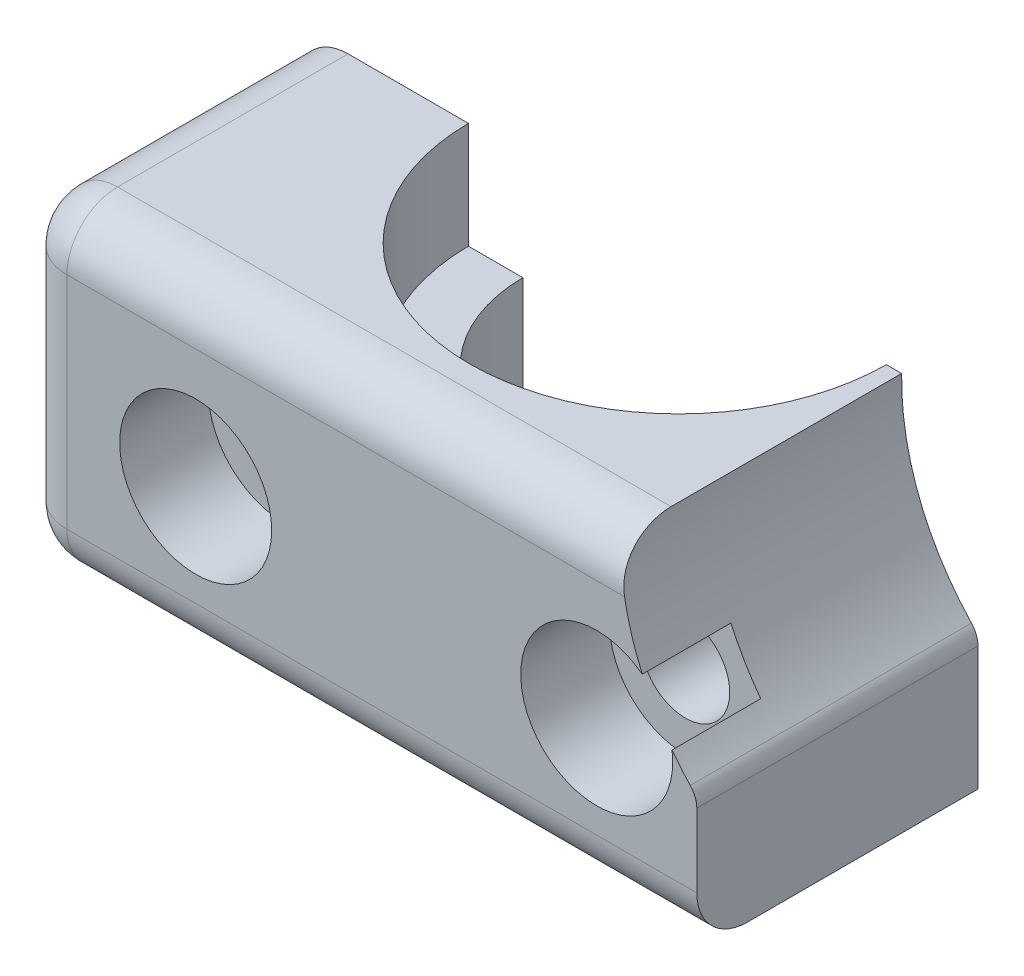
ISO-10303-21;
HEADER;
FILE_DESCRIPTION(('STEP AP214'),'2;1');
FILE_NAME('part.step','',(''),(''),'','','');
FILE_SCHEMA(('AUTOMOTIVE_DESIGN { 1 0 10303 214 1 1 1 1 }'));
ENDSEC;
DATA;
#1=APPLICATION_CONTEXT('core data for automotive mechanical design processes');
#2=APPLICATION_PROTOCOL_DEFINITION('international standard','automotive_design',2000,#1);
#3=PRODUCT_CONTEXT('',#1,'mechanical');
#4=PRODUCT('Part','Part','',(#3));
#5=PRODUCT_RELATED_PRODUCT_CATEGORY('part','',(#4));
#6=PRODUCT_DEFINITION_FORMATION('','',#4);
#7=PRODUCT_DEFINITION_CONTEXT('part definition',#1,'design');
#8=PRODUCT_DEFINITION('design','',#6,#7);
#9=PRODUCT_DEFINITION_SHAPE('','',#8);
#10=(LENGTH_UNIT() NAMED_UNIT(*) SI_UNIT(.MILLI.,.METRE.));
#11=(NAMED_UNIT(*) PLANE_ANGLE_UNIT() SI_UNIT($,.RADIAN.));
#12=(NAMED_UNIT(*) SI_UNIT($,.STERADIAN.) SOLID_ANGLE_UNIT());
#13=UNCERTAINTY_MEASURE_WITH_UNIT(LENGTH_MEASURE(1.E-05),#10,'distance_accuracy_value','');
#14=(GEOMETRIC_REPRESENTATION_CONTEXT(3) GLOBAL_UNCERTAINTY_ASSIGNED_CONTEXT((#13)) GLOBAL_UNIT_ASSIGNED_CONTEXT((#10,
#11,#12)) REPRESENTATION_CONTEXT('',''));
#15=CARTESIAN_POINT('',(0.,0.,0.));
#16=DIRECTION('',(0.,0.,1.));
#17=DIRECTION('',(1.,0.,0.));
#18=AXIS2_PLACEMENT_3D('',#15,#16,#17);
#19=CARTESIAN_POINT('',(-33.5734421203061,-17.5520097629016,27.2355834067229));
#20=DIRECTION('',(0.,1.,0.));
#21=DIRECTION('',(0.,0.,1.));
#22=AXIS2_PLACEMENT_3D('',#19,#20,#21);
#23=CYLINDRICAL_SURFACE('',#22,6.10000000000001);
#24=DIRECTION('',(0.,1.,0.));
#25=VECTOR('',#24,1.);
#26=CARTESIAN_POINT('',(-27.4736470417809,-17.5520097629016,27.2855834067229));
#27=LINE('',#26,#25);
#28=CARTESIAN_POINT('',(-27.4736470417809,10.7825140162545,27.2855834067229));
#29=VERTEX_POINT('',#28);
#30=CARTESIAN_POINT('',(-27.4736470417809,5.78251401625447,27.2855834067229));
#31=VERTEX_POINT('',#30);
#32=EDGE_CURVE('E319',#29,#31,#27,.F.);
#33=ORIENTED_EDGE('',*,*,#32,.T.);
#34=CARTESIAN_POINT('',(-33.5734421203061,5.78251401625447,27.2355834067229));
#35=DIRECTION('',(0.,-1.,0.));
#36=DIRECTION('',(0.,0.,-1.));
#37=AXIS2_PLACEMENT_3D('',#34,#35,#36);
#38=CIRCLE('',#37,6.10000000000001);
#39=CARTESIAN_POINT('',(-39.6732371988313,5.78251401625447,27.2855834067229));
#40=VERTEX_POINT('',#39);
#41=EDGE_CURVE('E48',#31,#40,#38,.T.);
#42=ORIENTED_EDGE('',*,*,#41,.T.);
#43=DIRECTION('',(0.,1.,0.));
#44=VECTOR('',#43,1.);
#45=CARTESIAN_POINT('',(-39.6732371988313,-17.5520097629016,27.2855834067229));
#46=LINE('',#45,#44);
#47=CARTESIAN_POINT('',(-39.6732371988313,10.7825140162545,27.2855834067229));
#48=VERTEX_POINT('',#47);
#49=EDGE_CURVE('E350',#40,#48,#46,.T.);
#50=ORIENTED_EDGE('',*,*,#49,.T.);
#51=CARTESIAN_POINT('',(-33.5734421203061,10.7825140162545,27.2355834067229));
#52=DIRECTION('',(0.,-1.,0.));
#53=DIRECTION('',(0.,0.,-1.));
#54=AXIS2_PLACEMENT_3D('',#51,#52,#53);
#55=CIRCLE('',#54,6.10000000000001);
#56=EDGE_CURVE('E324',#29,#48,#55,.T.);
#57=ORIENTED_EDGE('',*,*,#56,.F.);
#58=EDGE_LOOP('',(#33,#42,#50,#57));
#59=FACE_BOUND('',#58,.T.);
#60=ADVANCED_FACE('F45',(#59),#23,.F.);
#61=CARTESIAN_POINT('',(0.,5.78251401625447,0.));
#62=DIRECTION('',(0.,1.,0.));
#63=DIRECTION('',(0.,0.,1.));
#64=AXIS2_PLACEMENT_3D('',#61,#62,#63);
#65=PLANE('',#64);
#66=ORIENTED_EDGE('',*,*,#41,.F.);
#67=DIRECTION('',(-1.,0.,0.));
#68=VECTOR('',#67,1.);
#69=CARTESIAN_POINT('',(0.,5.78251401625446,27.2855834067229));
#70=LINE('',#69,#68);
#71=CARTESIAN_POINT('',(-25.323593636849,5.78251401625446,27.2855834067229));
#72=VERTEX_POINT('',#71);
#73=EDGE_CURVE('E327',#72,#31,#70,.T.);
#74=ORIENTED_EDGE('',*,*,#73,.F.);
#75=CARTESIAN_POINT('',(-33.5734421203061,5.78251401625447,27.2355834067229));
#76=DIRECTION('',(0.,1.,0.));
#77=DIRECTION('',(0.,0.,1.));
#78=AXIS2_PLACEMENT_3D('',#75,#76,#77);
#79=CIRCLE('',#78,8.25);
#80=CARTESIAN_POINT('',(-41.8232906037632,5.78251401625447,27.2855834067229));
#81=VERTEX_POINT('',#80);
#82=EDGE_CURVE('E454',#81,#72,#79,.T.);
#83=ORIENTED_EDGE('',*,*,#82,.F.);
#84=EDGE_CURVE('E204',#40,#81,#70,.T.);
#85=ORIENTED_EDGE('',*,*,#84,.F.);
#86=EDGE_LOOP('',(#66,#74,#83,#85));
#87=FACE_BOUND('',#86,.T.);
#88=ADVANCED_FACE('F272',(#87),#65,.F.);
#89=CARTESIAN_POINT('',(-41.4886552482093,8.28251401625446,34.8855834067228));
#90=DIRECTION('',(0.,0.,1.));
#91=DIRECTION('',(1.,0.,0.));
#92=AXIS2_PLACEMENT_3D('',#89,#90,#91);
#93=PLANE('',#92);
#94=CARTESIAN_POINT('',(-41.4886552482093,8.28251401625446,34.8855834067228));
#95=DIRECTION('',(0.,0.,1.));
#96=DIRECTION('',(1.,0.,0.));
#97=AXIS2_PLACEMENT_3D('',#94,#95,#96);
#98=CIRCLE('',#97,3.);
#99=CARTESIAN_POINT('',(-38.4886552482093,8.28251401625446,34.8855834067228));
#100=VERTEX_POINT('',#99);
#101=EDGE_CURVE('E351',#100,#100,#98,.T.);
#102=ORIENTED_EDGE('',*,*,#101,.T.);
#103=EDGE_LOOP('',(#102));
#104=FACE_BOUND('',#103,.T.);
#105=CARTESIAN_POINT('',(-41.4886552482093,8.28251401625446,34.8855834067228));
#106=DIRECTION('',(0.,0.,1.));
#107=DIRECTION('',(1.,0.,0.));
#108=AXIS2_PLACEMENT_3D('',#105,#106,#107);
#109=CIRCLE('',#108,1.75);
#110=CARTESIAN_POINT('',(-39.7386552482093,8.28251401625446,34.8855834067228));
#111=VERTEX_POINT('',#110);
#112=EDGE_CURVE('E353',#111,#111,#109,.F.);
#113=ORIENTED_EDGE('',*,*,#112,.T.);
#114=EDGE_LOOP('',(#113));
#115=FACE_BOUND('',#114,.T.);
#116=ADVANCED_FACE('F275',(#104,#115),#93,.T.);
#117=CARTESIAN_POINT('',(-41.4886552482093,8.28251401625446,22.285835938417));
#118=DIRECTION('',(0.,0.,1.));
#119=DIRECTION('',(1.,0.,0.));
#120=AXIS2_PLACEMENT_3D('',#117,#118,#119);
#121=CYLINDRICAL_SURFACE('',#120,1.75);
#122=ORIENTED_EDGE('',*,*,#112,.F.);
#123=EDGE_LOOP('',(#122));
#124=FACE_BOUND('',#123,.T.);
#125=CARTESIAN_POINT('',(-41.4886552482093,8.28251401625446,27.2855834067229));
#126=DIRECTION('',(0.,0.,-1.));
#127=DIRECTION('',(0.,1.,0.));
#128=AXIS2_PLACEMENT_3D('',#125,#126,#127);
#129=CIRCLE('',#128,1.75);
#130=CARTESIAN_POINT('',(-41.4886552482093,10.0325140162545,27.2855834067229));
#131=VERTEX_POINT('',#130);
#132=EDGE_CURVE('E201',#131,#131,#129,.F.);
#133=ORIENTED_EDGE('',*,*,#132,.F.);
#134=EDGE_LOOP('',(#133));
#135=FACE_BOUND('',#134,.T.);
#136=ADVANCED_FACE('F283',(#124,#135),#121,.F.);
#137=CARTESIAN_POINT('',(-41.4886552482093,8.28251401625446,34.8855834067228));
#138=DIRECTION('',(0.,0.,1.));
#139=DIRECTION('',(1.,0.,0.));
#140=AXIS2_PLACEMENT_3D('',#137,#138,#139);
#141=CYLINDRICAL_SURFACE('',#140,3.);
#142=ORIENTED_EDGE('',*,*,#101,.F.);
#143=EDGE_LOOP('',(#142));
#144=FACE_BOUND('',#143,.T.);
#145=CARTESIAN_POINT('',(-41.4886552482093,8.28251401625446,38.3855834067229));
#146=DIRECTION('',(0.,0.,1.));
#147=DIRECTION('',(1.,0.,0.));
#148=AXIS2_PLACEMENT_3D('',#145,#146,#147);
#149=CIRCLE('',#148,3.);
#150=CARTESIAN_POINT('',(-38.4886552482093,8.28251401625446,38.3855834067229));
#151=VERTEX_POINT('',#150);
#152=EDGE_CURVE('E357',#151,#151,#149,.T.);
#153=ORIENTED_EDGE('',*,*,#152,.T.);
#154=EDGE_LOOP('',(#153));
#155=FACE_BOUND('',#154,.T.);
#156=ADVANCED_FACE('F261',(#144,#155),#141,.F.);
#157=CARTESIAN_POINT('',(-48.5734421203059,2.28251401626882,113.118440972856));
#158=DIRECTION('',(-1.,0.,0.));
#159=DIRECTION('',(0.,0.,1.));
#160=AXIS2_PLACEMENT_3D('',#157,#158,#159);
#161=PLANE('',#160);
#162=DIRECTION('',(0.,1.,0.));
#163=VECTOR('',#162,1.);
#164=CARTESIAN_POINT('',(-48.5734421203059,2.28251401626883,27.2855834067229));
#165=LINE('',#164,#163);
#166=CARTESIAN_POINT('',(-48.5734421203059,4.28251401626883,27.2855834067229));
#167=VERTEX_POINT('',#166);
#168=CARTESIAN_POINT('',(-48.5734421203059,12.9825140162688,27.2855834067229));
#169=VERTEX_POINT('',#168);
#170=EDGE_CURVE('E389',#167,#169,#165,.T.);
#171=ORIENTED_EDGE('',*,*,#170,.F.);
#172=DIRECTION('',(0.,0.,-1.));
#173=VECTOR('',#172,1.);
#174=CARTESIAN_POINT('',(-48.5734421203059,4.28251401626882,113.118440972856));
#175=LINE('',#174,#173);
#176=CARTESIAN_POINT('',(-48.5734421203059,4.28251401626883,36.3855834067229));
#177=VERTEX_POINT('',#176);
#178=EDGE_CURVE('E381',#167,#177,#175,.F.);
#179=ORIENTED_EDGE('',*,*,#178,.T.);
#180=DIRECTION('',(0.,1.,0.));
#181=VECTOR('',#180,1.);
#182=CARTESIAN_POINT('',(-48.5734421203059,2.28251401626882,36.3855834067229));
#183=LINE('',#182,#181);
#184=CARTESIAN_POINT('',(-48.5734421203059,12.9825140162688,36.3855834067229));
#185=VERTEX_POINT('',#184);
#186=EDGE_CURVE('E383',#177,#185,#183,.T.);
#187=ORIENTED_EDGE('',*,*,#186,.T.);
#188=DIRECTION('',(0.,0.,-1.));
#189=VECTOR('',#188,1.);
#190=CARTESIAN_POINT('',(-48.5734421203059,12.9825140162688,113.118440972856));
#191=LINE('',#190,#189);
#192=EDGE_CURVE('E194',#185,#169,#191,.T.);
#193=ORIENTED_EDGE('',*,*,#192,.T.);
#194=EDGE_LOOP('',(#171,#179,#187,#193));
#195=FACE_BOUND('',#194,.T.);
#196=ADVANCED_FACE('F257',(#195),#161,.T.);
#197=CARTESIAN_POINT('',(19.4265578796941,2.28251401626882,113.118440972856));
#198=DIRECTION('',(0.,-1.,0.));
#199=DIRECTION('',(0.,0.,-1.));
#200=AXIS2_PLACEMENT_3D('',#197,#198,#199);
#201=PLANE('',#200);
#202=DIRECTION('',(-1.,0.,0.));
#203=VECTOR('',#202,1.);
#204=CARTESIAN_POINT('',(19.4265578796941,2.28251401626883,36.3855834067229));
#205=LINE('',#204,#203);
#206=CARTESIAN_POINT('',(-21.7082289924029,2.28251401626883,36.3855834067229));
#207=VERTEX_POINT('',#206);
#208=CARTESIAN_POINT('',(-46.5734421203059,2.28251401626883,36.3855834067229));
#209=VERTEX_POINT('',#208);
#210=EDGE_CURVE('E385',#207,#209,#205,.T.);
#211=ORIENTED_EDGE('',*,*,#210,.T.);
#212=DIRECTION('',(0.,0.,-1.));
#213=VECTOR('',#212,1.);
#214=CARTESIAN_POINT('',(-46.5734421203059,2.28251401626882,113.118440972856));
#215=LINE('',#214,#213);
#216=CARTESIAN_POINT('',(-46.5734421203059,2.28251401626883,27.2855834067229));
#217=VERTEX_POINT('',#216);
#218=EDGE_CURVE('E393',#209,#217,#215,.T.);
#219=ORIENTED_EDGE('',*,*,#218,.T.);
#220=DIRECTION('',(1.,0.,0.));
#221=VECTOR('',#220,1.);
#222=CARTESIAN_POINT('',(-48.5734421203059,2.28251401626883,27.2855834067229));
#223=LINE('',#222,#221);
#224=CARTESIAN_POINT('',(-41.8232906037632,2.28251401626883,27.2855834067229));
#225=VERTEX_POINT('',#224);
#226=EDGE_CURVE('E414',#217,#225,#223,.T.);
#227=ORIENTED_EDGE('',*,*,#226,.T.);
#228=CARTESIAN_POINT('',(-33.5734421203061,2.28251401626883,27.2355834067229));
#229=DIRECTION('',(0.,-1.,0.));
#230=DIRECTION('',(0.,0.,-1.));
#231=AXIS2_PLACEMENT_3D('',#228,#229,#230);
#232=CIRCLE('',#231,8.25000000000001);
#233=CARTESIAN_POINT('',(-25.3235936368489,2.28251401626883,27.2855834067229));
#234=VERTEX_POINT('',#233);
#235=EDGE_CURVE('E416',#225,#234,#232,.F.);
#236=ORIENTED_EDGE('',*,*,#235,.T.);
#237=CARTESIAN_POINT('',(-21.7082289924029,2.28251401626883,27.2855834067229));
#238=VERTEX_POINT('',#237);
#239=EDGE_CURVE('E366',#234,#238,#223,.T.);
#240=ORIENTED_EDGE('',*,*,#239,.T.);
#241=DIRECTION('',(0.,0.,-1.));
#242=VECTOR('',#241,1.);
#243=CARTESIAN_POINT('',(-21.7082289924029,2.28251401626883,38.3855834067229));
#244=LINE('',#243,#242);
#245=EDGE_CURVE('E215',#207,#238,#244,.T.);
#246=ORIENTED_EDGE('',*,*,#245,.F.);
#247=EDGE_LOOP('',(#211,#219,#227,#236,#240,#246));
#248=FACE_BOUND('',#247,.T.);
#249=ADVANCED_FACE('F253',(#248),#201,.T.);
#250=CARTESIAN_POINT('',(-25.6582289924029,8.28251401625447,22.285835938417));
#251=DIRECTION('',(0.,0.,1.));
#252=DIRECTION('',(1.,0.,0.));
#253=AXIS2_PLACEMENT_3D('',#250,#251,#252);
#254=CYLINDRICAL_SURFACE('',#253,1.75);
#255=CARTESIAN_POINT('',(-25.6582289924029,8.28251401625447,34.8855834067228));
#256=DIRECTION('',(0.,0.,1.));
#257=DIRECTION('',(1.,0.,0.));
#258=AXIS2_PLACEMENT_3D('',#255,#256,#257);
#259=CIRCLE('',#258,1.75);
#260=CARTESIAN_POINT('',(-23.9082289924029,8.28251401625447,34.8855834067228));
#261=VERTEX_POINT('',#260);
#262=EDGE_CURVE('E378',#261,#261,#259,.F.);
#263=ORIENTED_EDGE('',*,*,#262,.F.);
#264=EDGE_LOOP('',(#263));
#265=FACE_BOUND('',#264,.T.);
#266=CARTESIAN_POINT('',(-25.6582289924029,8.28251401625447,27.2855834067229));
#267=DIRECTION('',(0.,0.,-1.));
#268=DIRECTION('',(0.,1.,0.));
#269=AXIS2_PLACEMENT_3D('',#266,#267,#268);
#270=CIRCLE('',#269,1.75);
#271=CARTESIAN_POINT('',(-25.6582289924029,10.0325140162545,27.2855834067229));
#272=VERTEX_POINT('',#271);
#273=EDGE_CURVE('E222',#272,#272,#270,.F.);
#274=ORIENTED_EDGE('',*,*,#273,.F.);
#275=EDGE_LOOP('',(#274));
#276=FACE_BOUND('',#275,.T.);
#277=ADVANCED_FACE('F256',(#265,#276),#254,.F.);
#278=CARTESIAN_POINT('',(-25.6582289924029,8.28251401625447,34.8855834067228));
#279=DIRECTION('',(0.,0.,1.));
#280=DIRECTION('',(1.,0.,0.));
#281=AXIS2_PLACEMENT_3D('',#278,#279,#280);
#282=CYLINDRICAL_SURFACE('',#281,3.);
#283=DIRECTION('',(0.,0.,-1.));
#284=VECTOR('',#283,1.);
#285=CARTESIAN_POINT('',(-23.8586502619907,10.6828299106834,32.8355834067229));
#286=LINE('',#285,#284);
#287=CARTESIAN_POINT('',(-23.8586502619907,10.6828299106834,38.3855834067229));
#288=VERTEX_POINT('',#287);
#289=CARTESIAN_POINT('',(-23.8586502619907,10.6828299106834,34.8855834067228));
#290=VERTEX_POINT('',#289);
#291=EDGE_CURVE('E447',#288,#290,#286,.T.);
#292=ORIENTED_EDGE('',*,*,#291,.F.);
#293=CARTESIAN_POINT('',(-25.6582289924029,8.28251401625447,38.3855834067229));
#294=DIRECTION('',(0.,0.,1.));
#295=DIRECTION('',(1.,0.,0.));
#296=AXIS2_PLACEMENT_3D('',#293,#294,#295);
#297=CIRCLE('',#296,3.);
#298=CARTESIAN_POINT('',(-22.6848158736963,8.68102929262916,38.3855834067229));
#299=VERTEX_POINT('',#298);
#300=EDGE_CURVE('E362',#288,#299,#297,.T.);
#301=ORIENTED_EDGE('',*,*,#300,.T.);
#302=DIRECTION('',(0.,0.,-1.));
#303=VECTOR('',#302,1.);
#304=CARTESIAN_POINT('',(-22.6848158736964,8.68102929262916,32.8355834067229));
#305=LINE('',#304,#303);
#306=CARTESIAN_POINT('',(-22.6848158736964,8.68102929262916,34.8855834067228));
#307=VERTEX_POINT('',#306);
#308=EDGE_CURVE('E406',#307,#299,#305,.F.);
#309=ORIENTED_EDGE('',*,*,#308,.F.);
#310=CARTESIAN_POINT('',(-25.6582289924029,8.28251401625447,34.8855834067228));
#311=DIRECTION('',(0.,0.,1.));
#312=DIRECTION('',(1.,0.,0.));
#313=AXIS2_PLACEMENT_3D('',#310,#311,#312);
#314=CIRCLE('',#313,3.);
#315=EDGE_CURVE('E365',#290,#307,#314,.T.);
#316=ORIENTED_EDGE('',*,*,#315,.F.);
#317=EDGE_LOOP('',(#292,#301,#309,#316));
#318=FACE_BOUND('',#317,.T.);
#319=ADVANCED_FACE('F281',(#318),#282,.F.);
#320=CARTESIAN_POINT('',(-25.6582289924029,8.28251401625447,34.8855834067228));
#321=DIRECTION('',(0.,0.,1.));
#322=DIRECTION('',(1.,0.,0.));
#323=AXIS2_PLACEMENT_3D('',#320,#321,#322);
#324=PLANE('',#323);
#325=ORIENTED_EDGE('',*,*,#315,.T.);
#326=CARTESIAN_POINT('',(-14.5734421203059,14.7825140162689,34.8855834067228));
#327=DIRECTION('',(0.,0.,1.));
#328=DIRECTION('',(1.,0.,0.));
#329=AXIS2_PLACEMENT_3D('',#326,#327,#328);
#330=CIRCLE('',#329,10.15);
#331=EDGE_CURVE('E369',#307,#290,#330,.F.);
#332=ORIENTED_EDGE('',*,*,#331,.T.);
#333=EDGE_LOOP('',(#325,#332));
#334=FACE_BOUND('',#333,.T.);
#335=ORIENTED_EDGE('',*,*,#262,.T.);
#336=EDGE_LOOP('',(#335));
#337=FACE_BOUND('',#336,.T.);
#338=ADVANCED_FACE('F251',(#334,#337),#324,.T.);
#339=CARTESIAN_POINT('',(11.8546881565214,1.47626687487991,38.3855834067229));
#340=DIRECTION('',(0.,0.,1.));
#341=DIRECTION('',(1.,0.,0.));
#342=AXIS2_PLACEMENT_3D('',#339,#340,#341);
#343=PLANE('',#342);
#344=ORIENTED_EDGE('',*,*,#152,.F.);
#345=EDGE_LOOP('',(#344));
#346=FACE_BOUND('',#345,.T.);
#347=CARTESIAN_POINT('',(-14.5734421203059,14.7825140162689,38.3855834067229));
#348=DIRECTION('',(0.,0.,-1.));
#349=DIRECTION('',(-1.,0.,0.));
#350=AXIS2_PLACEMENT_3D('',#347,#348,#349);
#351=CIRCLE('',#350,10.15);
#352=CARTESIAN_POINT('',(-24.5625612005852,12.9825140162688,38.3855834067229));
#353=VERTEX_POINT('',#352);
#354=EDGE_CURVE('E221',#353,#288,#351,.F.);
#355=ORIENTED_EDGE('',*,*,#354,.F.);
#356=DIRECTION('',(-1.,0.,0.));
#357=VECTOR('',#356,1.);
#358=CARTESIAN_POINT('',(11.8546881565214,12.9825140162688,38.3855834067229));
#359=LINE('',#358,#357);
#360=CARTESIAN_POINT('',(-46.5734421203059,12.9825140162688,38.3855834067229));
#361=VERTEX_POINT('',#360);
#362=EDGE_CURVE('E375',#353,#361,#359,.T.);
#363=ORIENTED_EDGE('',*,*,#362,.T.);
#364=DIRECTION('',(0.,1.,0.));
#365=VECTOR('',#364,1.);
#366=CARTESIAN_POINT('',(-46.5734421203059,1.47626687487991,38.3855834067229));
#367=LINE('',#366,#365);
#368=CARTESIAN_POINT('',(-46.5734421203059,4.28251401626883,38.3855834067229));
#369=VERTEX_POINT('',#368);
#370=EDGE_CURVE('E377',#361,#369,#367,.F.);
#371=ORIENTED_EDGE('',*,*,#370,.T.);
#372=DIRECTION('',(-1.,0.,0.));
#373=VECTOR('',#372,1.);
#374=CARTESIAN_POINT('',(11.8546881565214,4.28251401626883,38.3855834067229));
#375=LINE('',#374,#373);
#376=CARTESIAN_POINT('',(-21.7082289924029,4.28251401626883,38.3855834067229));
#377=VERTEX_POINT('',#376);
#378=EDGE_CURVE('E177',#369,#377,#375,.F.);
#379=ORIENTED_EDGE('',*,*,#378,.T.);
#380=DIRECTION('',(0.,1.,0.));
#381=VECTOR('',#380,1.);
#382=CARTESIAN_POINT('',(-21.7082289924029,7.17684368205317,38.3855834067229));
#383=LINE('',#382,#381);
#384=CARTESIAN_POINT('',(-21.7082289924029,7.17684368205317,38.3855834067229));
#385=VERTEX_POINT('',#384);
#386=EDGE_CURVE('E216',#385,#377,#383,.F.);
#387=ORIENTED_EDGE('',*,*,#386,.F.);
#388=CARTESIAN_POINT('',(-22.6582289924029,7.17684368205317,38.3855834067229));
#389=DIRECTION('',(0.,0.,-1.));
#390=DIRECTION('',(-1.,0.,0.));
#391=AXIS2_PLACEMENT_3D('',#388,#389,#390);
#392=CIRCLE('',#391,0.95);
#393=CARTESIAN_POINT('',(-21.9662877736198,7.82777943137794,38.3855834067229));
#394=VERTEX_POINT('',#393);
#395=EDGE_CURVE('E390',#394,#385,#392,.T.);
#396=ORIENTED_EDGE('',*,*,#395,.F.);
#397=EDGE_CURVE('E404',#299,#394,#351,.F.);
#398=ORIENTED_EDGE('',*,*,#397,.F.);
#399=ORIENTED_EDGE('',*,*,#300,.F.);
#400=EDGE_LOOP('',(#355,#363,#371,#379,#387,#396,#398,#399));
#401=FACE_BOUND('',#400,.T.);
#402=ADVANCED_FACE('F248',(#346,#401),#343,.T.);
#403=CARTESIAN_POINT('',(11.8546881565214,14.9825140162688,25.9373592877478));
#404=DIRECTION('',(0.,1.,0.));
#405=DIRECTION('',(0.,0.,1.));
#406=AXIS2_PLACEMENT_3D('',#403,#404,#405);
#407=PLANE('',#406);
#408=DIRECTION('',(0.,0.,-1.));
#409=VECTOR('',#408,1.);
#410=CARTESIAN_POINT('',(-46.5734421203059,14.9825140162688,25.9373592877478));
#411=LINE('',#410,#409);
#412=CARTESIAN_POINT('',(-46.5734421203059,14.9825140162688,27.2855834067229));
#413=VERTEX_POINT('',#412);
#414=CARTESIAN_POINT('',(-46.5734421203059,14.9825140162688,36.3855834067229));
#415=VERTEX_POINT('',#414);
#416=EDGE_CURVE('E167',#413,#415,#411,.F.);
#417=ORIENTED_EDGE('',*,*,#416,.T.);
#418=DIRECTION('',(-1.,0.,0.));
#419=VECTOR('',#418,1.);
#420=CARTESIAN_POINT('',(11.8546881565214,14.9825140162688,36.3855834067229));
#421=LINE('',#420,#419);
#422=CARTESIAN_POINT('',(-24.7214714856557,14.9825140162688,36.3855834067229));
#423=VERTEX_POINT('',#422);
#424=EDGE_CURVE('E170',#415,#423,#421,.F.);
#425=ORIENTED_EDGE('',*,*,#424,.T.);
#426=DIRECTION('',(0.,0.,-1.));
#427=VECTOR('',#426,1.);
#428=CARTESIAN_POINT('',(-24.7214714856557,14.9825140162688,38.3855834067229));
#429=LINE('',#428,#427);
#430=CARTESIAN_POINT('',(-24.721461704932,14.9827615410213,27.2855834067229));
#431=VERTEX_POINT('',#430);
#432=EDGE_CURVE('E188',#423,#431,#429,.T.);
#433=ORIENTED_EDGE('',*,*,#432,.T.);
#434=DIRECTION('',(1.,0.,0.));
#435=VECTOR('',#434,1.);
#436=CARTESIAN_POINT('',(-48.5734421203059,14.9825140162688,27.2855834067229));
#437=LINE('',#436,#435);
#438=CARTESIAN_POINT('',(-25.3235936368489,14.9825140162688,27.2855834067229));
#439=VERTEX_POINT('',#438);
#440=EDGE_CURVE('E335',#439,#431,#437,.T.);
#441=ORIENTED_EDGE('',*,*,#440,.F.);
#442=CARTESIAN_POINT('',(-33.5734421203061,14.9825140162688,27.2355834067229));
#443=DIRECTION('',(0.,1.,0.));
#444=DIRECTION('',(0.,0.,1.));
#445=AXIS2_PLACEMENT_3D('',#442,#443,#444);
#446=CIRCLE('',#445,8.25000000000001);
#447=CARTESIAN_POINT('',(-41.8232906037632,14.9825140162688,27.2855834067229));
#448=VERTEX_POINT('',#447);
#449=EDGE_CURVE('E442',#448,#439,#446,.T.);
#450=ORIENTED_EDGE('',*,*,#449,.F.);
#451=EDGE_CURVE('E173',#413,#448,#437,.T.);
#452=ORIENTED_EDGE('',*,*,#451,.F.);
#453=EDGE_LOOP('',(#417,#425,#433,#441,#450,#452));
#454=FACE_BOUND('',#453,.T.);
#455=ADVANCED_FACE('F169',(#454),#407,.T.);
#456=CARTESIAN_POINT('',(-33.5734421203061,10.7825140162545,27.2355834067229));
#457=DIRECTION('',(0.,-1.,0.));
#458=DIRECTION('',(0.,0.,-1.));
#459=AXIS2_PLACEMENT_3D('',#456,#457,#458);
#460=PLANE('',#459);
#461=DIRECTION('',(1.,0.,0.));
#462=VECTOR('',#461,1.);
#463=CARTESIAN_POINT('',(-33.5734421203061,10.7825140162545,27.2855834067229));
#464=LINE('',#463,#462);
#465=CARTESIAN_POINT('',(-41.8232906037632,10.7825140162545,27.2855834067229));
#466=VERTEX_POINT('',#465);
#467=EDGE_CURVE('E338',#466,#48,#464,.T.);
#468=ORIENTED_EDGE('',*,*,#467,.F.);
#469=CARTESIAN_POINT('',(-33.5734421203061,10.7825140162545,27.2355834067229));
#470=DIRECTION('',(0.,-1.,0.));
#471=DIRECTION('',(0.,0.,-1.));
#472=AXIS2_PLACEMENT_3D('',#469,#470,#471);
#473=CIRCLE('',#472,8.25);
#474=CARTESIAN_POINT('',(-25.3235936368489,10.7825140162545,27.2855834067229));
#475=VERTEX_POINT('',#474);
#476=EDGE_CURVE('E456',#475,#466,#473,.T.);
#477=ORIENTED_EDGE('',*,*,#476,.F.);
#478=EDGE_CURVE('E334',#29,#475,#464,.T.);
#479=ORIENTED_EDGE('',*,*,#478,.F.);
#480=ORIENTED_EDGE('',*,*,#56,.T.);
#481=EDGE_LOOP('',(#468,#477,#479,#480));
#482=FACE_BOUND('',#481,.T.);
#483=ADVANCED_FACE('F265',(#482),#460,.F.);
#484=CARTESIAN_POINT('',(-33.5734421203061,33.2835140162685,27.2355834067229));
#485=DIRECTION('',(0.,-1.,0.));
#486=DIRECTION('',(0.,0.,-1.));
#487=AXIS2_PLACEMENT_3D('',#484,#485,#486);
#488=CYLINDRICAL_SURFACE('',#487,8.25000000000001);
#489=ORIENTED_EDGE('',*,*,#82,.T.);
#490=DIRECTION('',(0.,-1.,0.));
#491=VECTOR('',#490,1.);
#492=CARTESIAN_POINT('',(-25.3235936368489,33.2835140162685,27.2855834067229));
#493=LINE('',#492,#491);
#494=EDGE_CURVE('E331',#72,#234,#493,.T.);
#495=ORIENTED_EDGE('',*,*,#494,.T.);
#496=ORIENTED_EDGE('',*,*,#235,.F.);
#497=DIRECTION('',(0.,-1.,0.));
#498=VECTOR('',#497,1.);
#499=CARTESIAN_POINT('',(-41.8232906037632,33.2835140162685,27.2855834067229));
#500=LINE('',#499,#498);
#501=EDGE_CURVE('E348',#225,#81,#500,.F.);
#502=ORIENTED_EDGE('',*,*,#501,.T.);
#503=EDGE_LOOP('',(#489,#495,#496,#502));
#504=FACE_BOUND('',#503,.T.);
#505=ADVANCED_FACE('F270',(#504),#488,.F.);
#506=ORIENTED_EDGE('',*,*,#449,.T.);
#507=DIRECTION('',(0.,-1.,0.));
#508=VECTOR('',#507,1.);
#509=CARTESIAN_POINT('',(-25.3235936368489,33.2835140162685,27.2855834067229));
#510=LINE('',#509,#508);
#511=EDGE_CURVE('E446',#439,#475,#510,.T.);
#512=ORIENTED_EDGE('',*,*,#511,.T.);
#513=ORIENTED_EDGE('',*,*,#476,.T.);
#514=DIRECTION('',(0.,-1.,0.));
#515=VECTOR('',#514,1.);
#516=CARTESIAN_POINT('',(-41.8232906037632,33.2835140162685,27.2855834067229));
#517=LINE('',#516,#515);
#518=EDGE_CURVE('E339',#466,#448,#517,.F.);
#519=ORIENTED_EDGE('',*,*,#518,.T.);
#520=EDGE_LOOP('',(#506,#512,#513,#519));
#521=FACE_BOUND('',#520,.T.);
#522=ADVANCED_FACE('F266',(#521),#488,.F.);
#523=CARTESIAN_POINT('',(-48.5734421203059,2.28251401626883,27.2855834067229));
#524=DIRECTION('',(0.,0.,-1.));
#525=DIRECTION('',(0.,1.,0.));
#526=AXIS2_PLACEMENT_3D('',#523,#524,#525);
#527=PLANE('',#526);
#528=ORIENTED_EDGE('',*,*,#440,.T.);
#529=CARTESIAN_POINT('',(-14.5734421203059,14.7825140162689,27.2855834067229));
#530=DIRECTION('',(0.,0.,-1.));
#531=DIRECTION('',(0.,1.,0.));
#532=AXIS2_PLACEMENT_3D('',#529,#530,#531);
#533=CIRCLE('',#532,10.15);
#534=CARTESIAN_POINT('',(-21.9662877736198,7.82777943137794,27.2855834067229));
#535=VERTEX_POINT('',#534);
#536=EDGE_CURVE('E400',#535,#431,#533,.T.);
#537=ORIENTED_EDGE('',*,*,#536,.F.);
#538=CARTESIAN_POINT('',(-22.6582289924029,7.17684368205317,27.2855834067229));
#539=DIRECTION('',(0.,0.,-1.));
#540=DIRECTION('',(0.,1.,0.));
#541=AXIS2_PLACEMENT_3D('',#538,#539,#540);
#542=CIRCLE('',#541,0.95);
#543=CARTESIAN_POINT('',(-21.7082289924029,7.17684368205317,27.2855834067229));
#544=VERTEX_POINT('',#543);
#545=EDGE_CURVE('E409',#544,#535,#542,.F.);
#546=ORIENTED_EDGE('',*,*,#545,.F.);
#547=DIRECTION('',(0.,1.,0.));
#548=VECTOR('',#547,1.);
#549=CARTESIAN_POINT('',(-21.7082289924029,7.17684368205318,27.2855834067229));
#550=LINE('',#549,#548);
#551=EDGE_CURVE('E413',#238,#544,#550,.T.);
#552=ORIENTED_EDGE('',*,*,#551,.F.);
#553=ORIENTED_EDGE('',*,*,#239,.F.);
#554=ORIENTED_EDGE('',*,*,#494,.F.);
#555=ORIENTED_EDGE('',*,*,#73,.T.);
#556=ORIENTED_EDGE('',*,*,#32,.F.);
#557=ORIENTED_EDGE('',*,*,#478,.T.);
#558=ORIENTED_EDGE('',*,*,#511,.F.);
#559=EDGE_LOOP('',(#528,#537,#546,#552,#553,#554,#555,#556,#557,#558));
#560=FACE_BOUND('',#559,.T.);
#561=ORIENTED_EDGE('',*,*,#273,.T.);
#562=EDGE_LOOP('',(#561));
#563=FACE_BOUND('',#562,.T.);
#564=ADVANCED_FACE('F269',(#560,#563),#527,.T.);
#565=CARTESIAN_POINT('',(-14.5734421203059,14.7825140162689,38.3855834067229));
#566=DIRECTION('',(0.,0.,-1.));
#567=DIRECTION('',(-1.,0.,0.));
#568=AXIS2_PLACEMENT_3D('',#565,#566,#567);
#569=CYLINDRICAL_SURFACE('',#568,10.15);
#570=ORIENTED_EDGE('',*,*,#432,.F.);
#571=CARTESIAN_POINT('',(-24.7214714856557,14.9825140162688,36.3855834067229));
#572=CARTESIAN_POINT('',(-24.7214687961996,14.9825136515541,36.4418469726851));
#573=CARTESIAN_POINT('',(-24.7215186087979,14.9801383381768,36.4980835618194));
#574=CARTESIAN_POINT('',(-24.7216997714667,14.9706622925528,36.6101541568886));
#575=CARTESIAN_POINT('',(-24.7218311174462,14.9635617973945,36.6659881828803));
#576=CARTESIAN_POINT('',(-24.7223117488512,14.9352395034151,36.8321923881826));
#577=CARTESIAN_POINT('',(-24.7227477713082,14.9069967124848,36.9414491460746));
#578=CARTESIAN_POINT('',(-24.7233861046247,14.8325713638724,37.1536691308276));
#579=CARTESIAN_POINT('',(-24.723588302523,14.786380149653,37.2566292930612));
#580=CARTESIAN_POINT('',(-24.7230433066498,14.677372139731,37.4533331716581));
#581=CARTESIAN_POINT('',(-24.7222962595793,14.6145579142207,37.5470783097461));
#582=CARTESIAN_POINT('',(-24.7189995834447,14.4741742565103,37.7225825431078));
#583=CARTESIAN_POINT('',(-24.716451821771,14.3966201708096,37.8043539495124));
#584=CARTESIAN_POINT('',(-24.7086829496442,14.228963659599,37.9536913090797));
#585=CARTESIAN_POINT('',(-24.7034617200158,14.1388606748257,38.0212566287866));
#586=CARTESIAN_POINT('',(-24.6896397196322,13.9494515211161,38.1398460050323));
#587=CARTESIAN_POINT('',(-24.6810619741006,13.8502115047848,38.1909785253359));
#588=CARTESIAN_POINT('',(-24.6600235326863,13.6449770928878,38.2759437799714));
#589=CARTESIAN_POINT('',(-24.6475643141592,13.5389852793627,38.3097830834828));
#590=CARTESIAN_POINT('',(-24.6231751117033,13.3574077530852,38.3515968013025));
#591=CARTESIAN_POINT('',(-24.612310714091,13.2827414412104,38.3643584725339));
#592=CARTESIAN_POINT('',(-24.5887751632022,13.1328427453457,38.381352231076));
#593=CARTESIAN_POINT('',(-24.576106782076,13.057611394631,38.385597257472));
#594=CARTESIAN_POINT('',(-24.5625612005852,12.9825140162688,38.3855834067229));
#595=B_SPLINE_CURVE_WITH_KNOTS('',3,(#571,#572,#573,#574,#575,#576,#577,#578,#579,#580,#581,
#582,#583,#584,#585,#586,#587,#588,#589,#590,#591,#592,#593,#594),.UNSPECIFIED.,.F.,.F.,(4,2,2,
2,2,2,2,2,2,2,2,4),(0.,0.168686982369042,0.337365501419941,0.674176229030689,1.01114960272935,
1.34807090518263,1.68464332269139,2.02123074493357,2.35554859930557,2.68973936167631,
2.91884148197696,3.14759526985403),.UNSPECIFIED.);
#596=EDGE_CURVE('E187',#423,#353,#595,.T.);
#597=ORIENTED_EDGE('',*,*,#596,.T.);
#598=ORIENTED_EDGE('',*,*,#354,.T.);
#599=ORIENTED_EDGE('',*,*,#291,.T.);
#600=ORIENTED_EDGE('',*,*,#331,.F.);
#601=ORIENTED_EDGE('',*,*,#308,.T.);
#602=ORIENTED_EDGE('',*,*,#397,.T.);
#603=DIRECTION('',(0.,0.,-1.));
#604=VECTOR('',#603,1.);
#605=CARTESIAN_POINT('',(-21.9662877736198,7.82777943137794,38.3855834067229));
#606=LINE('',#605,#604);
#607=EDGE_CURVE('E403',#394,#535,#606,.T.);
#608=ORIENTED_EDGE('',*,*,#607,.T.);
#609=ORIENTED_EDGE('',*,*,#536,.T.);
#610=EDGE_LOOP('',(#570,#597,#598,#599,#600,#601,#602,#608,#609));
#611=FACE_BOUND('',#610,.T.);
#612=ADVANCED_FACE('F223',(#611),#569,.F.);
#613=CARTESIAN_POINT('',(-21.7082289924029,7.17684368205317,38.3855834067229));
#614=DIRECTION('',(1.,0.,0.));
#615=DIRECTION('',(0.,0.,-1.));
#616=AXIS2_PLACEMENT_3D('',#613,#614,#615);
#617=PLANE('',#616);
#618=ORIENTED_EDGE('',*,*,#386,.T.);
#619=CARTESIAN_POINT('',(-21.7082289924029,4.28251401626883,36.3855834067229));
#620=DIRECTION('',(1.,0.,0.));
#621=DIRECTION('',(0.,0.,-1.));
#622=AXIS2_PLACEMENT_3D('',#619,#620,#621);
#623=CIRCLE('',#622,2.);
#624=EDGE_CURVE('E213',#377,#207,#623,.T.);
#625=ORIENTED_EDGE('',*,*,#624,.T.);
#626=ORIENTED_EDGE('',*,*,#245,.T.);
#627=ORIENTED_EDGE('',*,*,#551,.T.);
#628=DIRECTION('',(0.,0.,-1.));
#629=VECTOR('',#628,1.);
#630=CARTESIAN_POINT('',(-21.7082289924029,7.17684368205317,38.3855834067229));
#631=LINE('',#630,#629);
#632=EDGE_CURVE('E420',#385,#544,#631,.T.);
#633=ORIENTED_EDGE('',*,*,#632,.F.);
#634=EDGE_LOOP('',(#618,#625,#626,#627,#633));
#635=FACE_BOUND('',#634,.T.);
#636=ADVANCED_FACE('F303',(#635),#617,.T.);
#637=CARTESIAN_POINT('',(-22.6582289924029,7.17684368205317,38.3855834067229));
#638=DIRECTION('',(0.,0.,-1.));
#639=DIRECTION('',(-1.,0.,0.));
#640=AXIS2_PLACEMENT_3D('',#637,#638,#639);
#641=CYLINDRICAL_SURFACE('',#640,0.95);
#642=ORIENTED_EDGE('',*,*,#632,.T.);
#643=ORIENTED_EDGE('',*,*,#545,.T.);
#644=ORIENTED_EDGE('',*,*,#607,.F.);
#645=ORIENTED_EDGE('',*,*,#395,.T.);
#646=EDGE_LOOP('',(#642,#643,#644,#645));
#647=FACE_BOUND('',#646,.T.);
#648=ADVANCED_FACE('F305',(#647),#641,.T.);
#649=ORIENTED_EDGE('',*,*,#226,.F.);
#650=CARTESIAN_POINT('',(-46.5734421203059,4.28251401626883,27.2855834067229));
#651=DIRECTION('',(0.,0.,-1.));
#652=DIRECTION('',(0.,1.,0.));
#653=AXIS2_PLACEMENT_3D('',#650,#651,#652);
#654=CIRCLE('',#653,2.);
#655=EDGE_CURVE('E387',#217,#167,#654,.T.);
#656=ORIENTED_EDGE('',*,*,#655,.T.);
#657=ORIENTED_EDGE('',*,*,#170,.T.);
#658=CARTESIAN_POINT('',(-46.5734421203059,12.9825140162688,27.2855834067229));
#659=DIRECTION('',(0.,0.,-1.));
#660=DIRECTION('',(0.,1.,0.));
#661=AXIS2_PLACEMENT_3D('',#658,#659,#660);
#662=CIRCLE('',#661,2.);
#663=EDGE_CURVE('E345',#169,#413,#662,.T.);
#664=ORIENTED_EDGE('',*,*,#663,.T.);
#665=ORIENTED_EDGE('',*,*,#451,.T.);
#666=ORIENTED_EDGE('',*,*,#518,.F.);
#667=ORIENTED_EDGE('',*,*,#467,.T.);
#668=ORIENTED_EDGE('',*,*,#49,.F.);
#669=ORIENTED_EDGE('',*,*,#84,.T.);
#670=ORIENTED_EDGE('',*,*,#501,.F.);
#671=EDGE_LOOP('',(#649,#656,#657,#664,#665,#666,#667,#668,#669,#670));
#672=FACE_BOUND('',#671,.T.);
#673=ORIENTED_EDGE('',*,*,#132,.T.);
#674=EDGE_LOOP('',(#673));
#675=FACE_BOUND('',#674,.T.);
#676=ADVANCED_FACE('F302',(#672,#675),#527,.T.);
#677=CARTESIAN_POINT('',(-46.5734421203059,12.9825140162688,113.118440972856));
#678=DIRECTION('',(0.,0.,-1.));
#679=DIRECTION('',(-1.,0.,0.));
#680=AXIS2_PLACEMENT_3D('',#677,#678,#679);
#681=CYLINDRICAL_SURFACE('',#680,2.);
#682=ORIENTED_EDGE('',*,*,#663,.F.);
#683=ORIENTED_EDGE('',*,*,#192,.F.);
#684=CARTESIAN_POINT('',(-46.5734421203059,12.9825140162688,36.3855834067229));
#685=DIRECTION('',(0.,0.,1.));
#686=DIRECTION('',(1.,0.,0.));
#687=AXIS2_PLACEMENT_3D('',#684,#685,#686);
#688=CIRCLE('',#687,2.);
#689=EDGE_CURVE('E192',#415,#185,#688,.T.);
#690=ORIENTED_EDGE('',*,*,#689,.F.);
#691=ORIENTED_EDGE('',*,*,#416,.F.);
#692=EDGE_LOOP('',(#682,#683,#690,#691));
#693=FACE_BOUND('',#692,.T.);
#694=ADVANCED_FACE('F193',(#693),#681,.T.);
#695=CARTESIAN_POINT('',(11.8546881565214,12.9825140162688,36.3855834067229));
#696=DIRECTION('',(-1.,0.,0.));
#697=DIRECTION('',(0.,-1.,0.));
#698=AXIS2_PLACEMENT_3D('',#695,#696,#697);
#699=CYLINDRICAL_SURFACE('',#698,2.);
#700=ORIENTED_EDGE('',*,*,#596,.F.);
#701=ORIENTED_EDGE('',*,*,#424,.F.);
#702=CARTESIAN_POINT('',(-46.5734421203059,12.9825140162688,36.3855834067229));
#703=DIRECTION('',(-1.,0.,0.));
#704=DIRECTION('',(0.,0.,1.));
#705=AXIS2_PLACEMENT_3D('',#702,#703,#704);
#706=CIRCLE('',#705,2.);
#707=EDGE_CURVE('E185',#361,#415,#706,.T.);
#708=ORIENTED_EDGE('',*,*,#707,.F.);
#709=ORIENTED_EDGE('',*,*,#362,.F.);
#710=EDGE_LOOP('',(#700,#701,#708,#709));
#711=FACE_BOUND('',#710,.T.);
#712=ADVANCED_FACE('F182',(#711),#699,.T.);
#713=CARTESIAN_POINT('',(-46.5734421203059,12.9825140162688,36.3855834067229));
#714=DIRECTION('',(0.,0.,1.));
#715=DIRECTION('',(1.,0.,0.));
#716=AXIS2_PLACEMENT_3D('',#713,#714,#715);
#717=SPHERICAL_SURFACE('',#716,2.);
#718=ORIENTED_EDGE('',*,*,#707,.T.);
#719=ORIENTED_EDGE('',*,*,#689,.T.);
#720=CARTESIAN_POINT('',(-46.5734421203059,12.9825140162688,36.3855834067229));
#721=DIRECTION('',(0.,1.,0.));
#722=DIRECTION('',(0.,0.,1.));
#723=AXIS2_PLACEMENT_3D('',#720,#721,#722);
#724=CIRCLE('',#723,2.);
#725=EDGE_CURVE('E197',#361,#185,#724,.F.);
#726=ORIENTED_EDGE('',*,*,#725,.F.);
#727=EDGE_LOOP('',(#718,#719,#726));
#728=FACE_BOUND('',#727,.T.);
#729=ADVANCED_FACE('F199',(#728),#717,.T.);
#730=CARTESIAN_POINT('',(-46.5734421203059,2.28251401626882,36.3855834067229));
#731=DIRECTION('',(0.,1.,0.));
#732=DIRECTION('',(-1.,0.,0.));
#733=AXIS2_PLACEMENT_3D('',#730,#731,#732);
#734=CYLINDRICAL_SURFACE('',#733,2.);
#735=ORIENTED_EDGE('',*,*,#725,.T.);
#736=ORIENTED_EDGE('',*,*,#186,.F.);
#737=CARTESIAN_POINT('',(-46.5734421203059,4.28251401626883,36.3855834067229));
#738=DIRECTION('',(0.,-1.,0.));
#739=DIRECTION('',(0.,0.,-1.));
#740=AXIS2_PLACEMENT_3D('',#737,#738,#739);
#741=CIRCLE('',#740,2.);
#742=EDGE_CURVE('E54',#369,#177,#741,.T.);
#743=ORIENTED_EDGE('',*,*,#742,.F.);
#744=ORIENTED_EDGE('',*,*,#370,.F.);
#745=EDGE_LOOP('',(#735,#736,#743,#744));
#746=FACE_BOUND('',#745,.T.);
#747=ADVANCED_FACE('F232',(#746),#734,.T.);
#748=CARTESIAN_POINT('',(19.4265578796941,4.28251401626883,36.3855834067229));
#749=DIRECTION('',(-1.,0.,0.));
#750=DIRECTION('',(0.,-1.,0.));
#751=AXIS2_PLACEMENT_3D('',#748,#749,#750);
#752=CYLINDRICAL_SURFACE('',#751,2.);
#753=ORIENTED_EDGE('',*,*,#624,.F.);
#754=ORIENTED_EDGE('',*,*,#378,.F.);
#755=CARTESIAN_POINT('',(-46.5734421203059,4.28251401626883,36.3855834067229));
#756=DIRECTION('',(-1.,0.,0.));
#757=DIRECTION('',(0.,0.,1.));
#758=AXIS2_PLACEMENT_3D('',#755,#756,#757);
#759=CIRCLE('',#758,2.);
#760=EDGE_CURVE('E208',#209,#369,#759,.T.);
#761=ORIENTED_EDGE('',*,*,#760,.F.);
#762=ORIENTED_EDGE('',*,*,#210,.F.);
#763=EDGE_LOOP('',(#753,#754,#761,#762));
#764=FACE_BOUND('',#763,.T.);
#765=ADVANCED_FACE('F235',(#764),#752,.T.);
#766=CARTESIAN_POINT('',(-46.5734421203059,4.28251401626883,36.3855834067229));
#767=DIRECTION('',(0.,0.,1.));
#768=DIRECTION('',(1.,0.,0.));
#769=AXIS2_PLACEMENT_3D('',#766,#767,#768);
#770=SPHERICAL_SURFACE('',#769,2.);
#771=ORIENTED_EDGE('',*,*,#760,.T.);
#772=ORIENTED_EDGE('',*,*,#742,.T.);
#773=CARTESIAN_POINT('',(-46.5734421203059,4.28251401626883,36.3855834067229));
#774=DIRECTION('',(0.,0.,1.));
#775=DIRECTION('',(1.,0.,0.));
#776=AXIS2_PLACEMENT_3D('',#773,#774,#775);
#777=CIRCLE('',#776,2.);
#778=EDGE_CURVE('E12',#209,#177,#777,.F.);
#779=ORIENTED_EDGE('',*,*,#778,.F.);
#780=EDGE_LOOP('',(#771,#772,#779));
#781=FACE_BOUND('',#780,.T.);
#782=ADVANCED_FACE('F239',(#781),#770,.T.);
#783=CARTESIAN_POINT('',(-46.5734421203059,4.28251401626882,113.118440972856));
#784=DIRECTION('',(0.,0.,-1.));
#785=DIRECTION('',(-1.,0.,0.));
#786=AXIS2_PLACEMENT_3D('',#783,#784,#785);
#787=CYLINDRICAL_SURFACE('',#786,2.);
#788=ORIENTED_EDGE('',*,*,#778,.T.);
#789=ORIENTED_EDGE('',*,*,#178,.F.);
#790=ORIENTED_EDGE('',*,*,#655,.F.);
#791=ORIENTED_EDGE('',*,*,#218,.F.);
#792=EDGE_LOOP('',(#788,#789,#790,#791));
#793=FACE_BOUND('',#792,.T.);
#794=ADVANCED_FACE('F243',(#793),#787,.T.);
#795=CLOSED_SHELL('',(#60,#88,#116,#136,#156,#196,#249,#277,#319,#338,#402,#455,#483,#505,#522,
#564,#612,#636,#648,#676,#694,#712,#729,#747,#765,#782,#794));
#796=MANIFOLD_SOLID_BREP('B2',#795);
#797=CARTESIAN_POINT('',(19.4265578796941,2.28251401626882,113.118440972856));
#798=DIRECTION('',(0.,-1.,0.));
#799=DIRECTION('',(0.,0.,-1.));
#800=AXIS2_PLACEMENT_3D('',#797,#798,#799);
#801=PLANE('',#800);
#802=DIRECTION('',(-0.999966406315603,0.,-0.0081967213114798));
#803=VECTOR('',#802,1.);
#804=CARTESIAN_POINT('',(-26.77367055736,2.28251401626883,27.2913211116409));
#805=LINE('',#804,#803);
#806=CARTESIAN_POINT('',(-26.77367055736,2.28251401626883,27.2913211116409));
#807=VERTEX_POINT('',#806);
#808=CARTESIAN_POINT('',(-27.4736470417809,2.28251401626883,27.2855834067229));
#809=VERTEX_POINT('',#808);
#810=EDGE_CURVE('E709',#807,#809,#805,.T.);
#811=ORIENTED_EDGE('',*,*,#810,.F.);
#812=CARTESIAN_POINT('',(-33.5734421203061,2.28251401626883,27.2355834067229));
#813=DIRECTION('',(0.,-1.,0.));
#814=DIRECTION('',(0.,0.,-1.));
#815=AXIS2_PLACEMENT_3D('',#812,#813,#814);
#816=CIRCLE('',#815,6.80000000000001);
#817=CARTESIAN_POINT('',(-40.3732136832522,2.28251401626883,27.2913211116409));
#818=VERTEX_POINT('',#817);
#819=EDGE_CURVE('E740',#807,#818,#816,.T.);
#820=ORIENTED_EDGE('',*,*,#819,.T.);
#821=DIRECTION('',(-0.999966406315603,0.,0.0081967213114748));
#822=VECTOR('',#821,1.);
#823=CARTESIAN_POINT('',(-39.6732371988313,2.28251401626883,27.2855834067229));
#824=LINE('',#823,#822);
#825=CARTESIAN_POINT('',(-39.6732371988313,2.28251401626883,27.2855834067229));
#826=VERTEX_POINT('',#825);
#827=EDGE_CURVE('E733',#826,#818,#824,.T.);
#828=ORIENTED_EDGE('',*,*,#827,.F.);
#829=CARTESIAN_POINT('',(-33.5734421203061,2.28251401626883,27.2355834067229));
#830=DIRECTION('',(0.,-1.,0.));
#831=DIRECTION('',(0.,0.,-1.));
#832=AXIS2_PLACEMENT_3D('',#829,#830,#831);
#833=CIRCLE('',#832,6.10000000000001);
#834=EDGE_CURVE('E698',#809,#826,#833,.T.);
#835=ORIENTED_EDGE('',*,*,#834,.F.);
#836=EDGE_LOOP('',(#811,#820,#828,#835));
#837=FACE_BOUND('',#836,.T.);
#838=ADVANCED_FACE('F674',(#837),#801,.T.);
#839=CARTESIAN_POINT('',(-33.5734421203061,-12.9000441750572,27.2355834067229));
#840=DIRECTION('',(0.,1.,0.));
#841=DIRECTION('',(0.,0.,1.));
#842=AXIS2_PLACEMENT_3D('',#839,#840,#841);
#843=CYLINDRICAL_SURFACE('',#842,6.80000000000001);
#844=DIRECTION('',(0.,1.,0.));
#845=VECTOR('',#844,1.);
#846=CARTESIAN_POINT('',(-26.77367055736,-12.9000441750572,27.2913211116409));
#847=LINE('',#846,#845);
#848=CARTESIAN_POINT('',(-26.77367055736,5.58251401625447,27.2913211116409));
#849=VERTEX_POINT('',#848);
#850=EDGE_CURVE('E43',#807,#849,#847,.T.);
#851=ORIENTED_EDGE('',*,*,#850,.T.);
#852=CARTESIAN_POINT('',(-33.5734421203061,5.58251401625447,27.2355834067229));
#853=DIRECTION('',(0.,-1.,0.));
#854=DIRECTION('',(1.,0.,0.));
#855=AXIS2_PLACEMENT_3D('',#852,#853,#854);
#856=CIRCLE('',#855,6.80000000000001);
#857=CARTESIAN_POINT('',(-40.3732136832522,5.58251401625447,27.2913211116409));
#858=VERTEX_POINT('',#857);
#859=EDGE_CURVE('E713',#849,#858,#856,.T.);
#860=ORIENTED_EDGE('',*,*,#859,.T.);
#861=DIRECTION('',(0.,1.,0.));
#862=VECTOR('',#861,1.);
#863=CARTESIAN_POINT('',(-40.3732136832522,-12.9000441750572,27.2913211116409));
#864=LINE('',#863,#862);
#865=EDGE_CURVE('E682',#818,#858,#864,.T.);
#866=ORIENTED_EDGE('',*,*,#865,.F.);
#867=ORIENTED_EDGE('',*,*,#819,.F.);
#868=EDGE_LOOP('',(#851,#860,#866,#867));
#869=FACE_BOUND('',#868,.T.);
#870=ADVANCED_FACE('F747',(#869),#843,.T.);
#871=CARTESIAN_POINT('',(-39.6732371988313,-12.9000441750572,27.2855834067229));
#872=DIRECTION('',(-0.0081967213114748,0.,-0.999966406315603));
#873=DIRECTION('',(-0.999966406315603,0.,0.0081967213114748));
#874=AXIS2_PLACEMENT_3D('',#871,#872,#873);
#875=PLANE('',#874);
#876=DIRECTION('',(-0.999966406315603,0.,0.0081967213114748));
#877=VECTOR('',#876,1.);
#878=CARTESIAN_POINT('',(-39.6732371988313,5.58251401625447,27.2855834067229));
#879=LINE('',#878,#877);
#880=CARTESIAN_POINT('',(-39.6732371988313,5.58251401625447,27.2855834067229));
#881=VERTEX_POINT('',#880);
#882=EDGE_CURVE('E689',#881,#858,#879,.T.);
#883=ORIENTED_EDGE('',*,*,#882,.F.);
#884=DIRECTION('',(0.,1.,0.));
#885=VECTOR('',#884,1.);
#886=CARTESIAN_POINT('',(-39.6732371988313,-12.9000441750572,27.2855834067229));
#887=LINE('',#886,#885);
#888=EDGE_CURVE('E730',#826,#881,#887,.T.);
#889=ORIENTED_EDGE('',*,*,#888,.F.);
#890=ORIENTED_EDGE('',*,*,#827,.T.);
#891=ORIENTED_EDGE('',*,*,#865,.T.);
#892=EDGE_LOOP('',(#883,#889,#890,#891));
#893=FACE_BOUND('',#892,.T.);
#894=ADVANCED_FACE('F728',(#893),#875,.T.);
#895=CARTESIAN_POINT('',(-26.77367055736,-12.9000441750572,27.2913211116409));
#896=DIRECTION('',(0.0081967213114798,0.,-0.999966406315603));
#897=DIRECTION('',(-0.999966406315603,0.,-0.0081967213114798));
#898=AXIS2_PLACEMENT_3D('',#895,#896,#897);
#899=PLANE('',#898);
#900=DIRECTION('',(-0.999966406315603,0.,-0.0081967213114798));
#901=VECTOR('',#900,1.);
#902=CARTESIAN_POINT('',(-26.77367055736,5.58251401625447,27.2913211116409));
#903=LINE('',#902,#901);
#904=CARTESIAN_POINT('',(-27.4736470417809,5.58251401625447,27.2855834067229));
#905=VERTEX_POINT('',#904);
#906=EDGE_CURVE('E716',#849,#905,#903,.T.);
#907=ORIENTED_EDGE('',*,*,#906,.F.);
#908=ORIENTED_EDGE('',*,*,#850,.F.);
#909=ORIENTED_EDGE('',*,*,#810,.T.);
#910=DIRECTION('',(0.,1.,0.));
#911=VECTOR('',#910,1.);
#912=CARTESIAN_POINT('',(-27.4736470417809,-12.9000441750572,27.2855834067229));
#913=LINE('',#912,#911);
#914=EDGE_CURVE('E736',#809,#905,#913,.T.);
#915=ORIENTED_EDGE('',*,*,#914,.T.);
#916=EDGE_LOOP('',(#907,#908,#909,#915));
#917=FACE_BOUND('',#916,.T.);
#918=ADVANCED_FACE('F748',(#917),#899,.T.);
#919=CARTESIAN_POINT('',(-33.5734421203061,-17.5520097629016,27.2355834067229));
#920=DIRECTION('',(0.,1.,0.));
#921=DIRECTION('',(0.,0.,1.));
#922=AXIS2_PLACEMENT_3D('',#919,#920,#921);
#923=CYLINDRICAL_SURFACE('',#922,6.10000000000001);
#924=CARTESIAN_POINT('',(-33.5734421203061,5.58251401625447,27.2355834067229));
#925=DIRECTION('',(0.,-1.,0.));
#926=DIRECTION('',(0.,0.,-1.));
#927=AXIS2_PLACEMENT_3D('',#924,#925,#926);
#928=CIRCLE('',#927,6.10000000000001);
#929=EDGE_CURVE('E719',#905,#881,#928,.T.);
#930=ORIENTED_EDGE('',*,*,#929,.F.);
#931=ORIENTED_EDGE('',*,*,#914,.F.);
#932=ORIENTED_EDGE('',*,*,#834,.T.);
#933=ORIENTED_EDGE('',*,*,#888,.T.);
#934=EDGE_LOOP('',(#930,#931,#932,#933));
#935=FACE_BOUND('',#934,.T.);
#936=ADVANCED_FACE('F676',(#935),#923,.F.);
#937=CARTESIAN_POINT('',(-33.5734421203061,5.58251401625447,27.2355834067229));
#938=DIRECTION('',(0.,-1.,0.));
#939=DIRECTION('',(1.,0.,0.));
#940=AXIS2_PLACEMENT_3D('',#937,#938,#939);
#941=PLANE('',#940);
#942=ORIENTED_EDGE('',*,*,#859,.F.);
#943=ORIENTED_EDGE('',*,*,#906,.T.);
#944=ORIENTED_EDGE('',*,*,#929,.T.);
#945=ORIENTED_EDGE('',*,*,#882,.T.);
#946=EDGE_LOOP('',(#942,#943,#944,#945));
#947=FACE_BOUND('',#946,.T.);
#948=ADVANCED_FACE('F720',(#947),#941,.F.);
#949=CLOSED_SHELL('',(#838,#870,#894,#918,#936,#948));
#950=MANIFOLD_SOLID_BREP('B6',#949);
#951=ADVANCED_BREP_SHAPE_REPRESENTATION('',(#18,#796,#950),#14);
#952=SHAPE_DEFINITION_REPRESENTATION(#9,#951);
ENDSEC;
END-ISO-10303-21;
